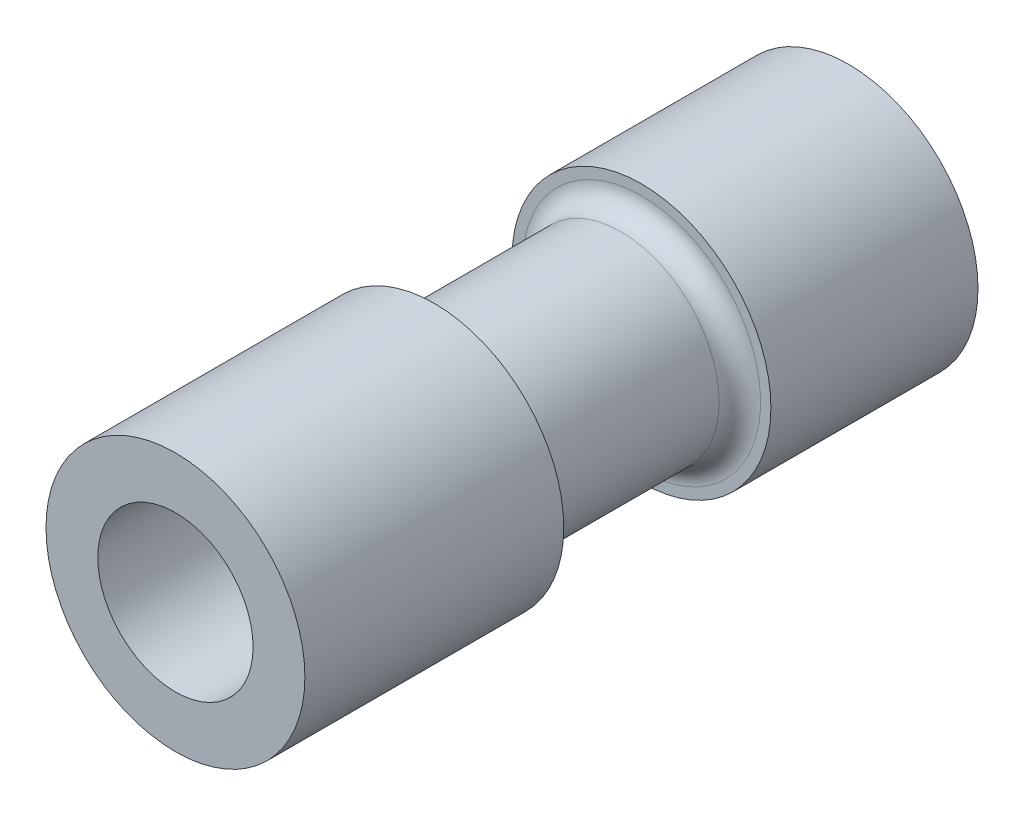
ISO-10303-21;
HEADER;
FILE_DESCRIPTION(('STEP AP214'),'2;1');
FILE_NAME('part.step','',(''),(''),'','','');
FILE_SCHEMA(('AUTOMOTIVE_DESIGN { 1 0 10303 214 1 1 1 1 }'));
ENDSEC;
DATA;
#1=APPLICATION_CONTEXT('core data for automotive mechanical design processes');
#2=APPLICATION_PROTOCOL_DEFINITION('international standard','automotive_design',2000,#1);
#3=PRODUCT_CONTEXT('',#1,'mechanical');
#4=PRODUCT('Part','Part','',(#3));
#5=PRODUCT_RELATED_PRODUCT_CATEGORY('part','',(#4));
#6=PRODUCT_DEFINITION_FORMATION('','',#4);
#7=PRODUCT_DEFINITION_CONTEXT('part definition',#1,'design');
#8=PRODUCT_DEFINITION('design','',#6,#7);
#9=PRODUCT_DEFINITION_SHAPE('','',#8);
#10=(LENGTH_UNIT() NAMED_UNIT(*) SI_UNIT(.MILLI.,.METRE.));
#11=(NAMED_UNIT(*) PLANE_ANGLE_UNIT() SI_UNIT($,.RADIAN.));
#12=(NAMED_UNIT(*) SI_UNIT($,.STERADIAN.) SOLID_ANGLE_UNIT());
#13=UNCERTAINTY_MEASURE_WITH_UNIT(LENGTH_MEASURE(1.E-05),#10,'distance_accuracy_value','');
#14=(GEOMETRIC_REPRESENTATION_CONTEXT(3) GLOBAL_UNCERTAINTY_ASSIGNED_CONTEXT((#13)) GLOBAL_UNIT_ASSIGNED_CONTEXT((#10,
#11,#12)) REPRESENTATION_CONTEXT('',''));
#15=CARTESIAN_POINT('',(0.,0.,0.));
#16=DIRECTION('',(0.,0.,1.));
#17=DIRECTION('',(1.,0.,0.));
#18=AXIS2_PLACEMENT_3D('',#15,#16,#17);
#19=CARTESIAN_POINT('',(0.,0.,13.));
#20=DIRECTION('',(0.,0.,1.));
#21=DIRECTION('',(1.,0.,0.));
#22=AXIS2_PLACEMENT_3D('',#19,#20,#21);
#23=CYLINDRICAL_SURFACE('',#22,0.999999999999997);
#24=CARTESIAN_POINT('',(0.,0.,0.));
#25=DIRECTION('',(0.,0.,1.));
#26=DIRECTION('',(1.,0.,0.));
#27=AXIS2_PLACEMENT_3D('',#24,#25,#26);
#28=CIRCLE('',#27,0.999999999999996);
#29=CARTESIAN_POINT('',(0.999999999999996,0.,0.));
#30=VERTEX_POINT('',#29);
#31=EDGE_CURVE('E123',#30,#30,#28,.T.);
#32=ORIENTED_EDGE('',*,*,#31,.F.);
#33=EDGE_LOOP('',(#32));
#34=FACE_BOUND('',#33,.T.);
#35=CARTESIAN_POINT('',(0.,0.,5.));
#36=DIRECTION('',(0.,0.,1.));
#37=DIRECTION('',(1.,0.,0.));
#38=AXIS2_PLACEMENT_3D('',#35,#36,#37);
#39=CIRCLE('',#38,0.999999999999997);
#40=CARTESIAN_POINT('',(0.999999999999997,0.,5.));
#41=VERTEX_POINT('',#40);
#42=EDGE_CURVE('E36',#41,#41,#39,.F.);
#43=ORIENTED_EDGE('',*,*,#42,.F.);
#44=EDGE_LOOP('',(#43));
#45=FACE_BOUND('',#44,.T.);
#46=ADVANCED_FACE('F32',(#34,#45),#23,.F.);
#47=CARTESIAN_POINT('',(0.,0.,13.));
#48=DIRECTION('',(0.,0.,-1.));
#49=DIRECTION('',(-1.,0.,0.));
#50=AXIS2_PLACEMENT_3D('',#47,#48,#49);
#51=CYLINDRICAL_SURFACE('',#50,2.5);
#52=CARTESIAN_POINT('',(0.,0.,0.));
#53=DIRECTION('',(0.,0.,1.));
#54=DIRECTION('',(1.,0.,0.));
#55=AXIS2_PLACEMENT_3D('',#52,#53,#54);
#56=CIRCLE('',#55,2.5);
#57=CARTESIAN_POINT('',(-2.5,0.,0.));
#58=VERTEX_POINT('',#57);
#59=EDGE_CURVE('E40',#58,#58,#56,.T.);
#60=CARTESIAN_POINT('',(0.,0.,4.));
#61=DIRECTION('',(0.,0.,1.));
#62=DIRECTION('',(1.,0.,0.));
#63=AXIS2_PLACEMENT_3D('',#60,#61,#62);
#64=CIRCLE('',#63,2.5);
#65=CARTESIAN_POINT('',(-2.5,0.,4.));
#66=VERTEX_POINT('',#65);
#67=EDGE_CURVE('E45',#66,#66,#64,.T.);
#68=CARTESIAN_POINT('',(-2.5,0.,0.));
#69=CARTESIAN_POINT('',(-2.5,0.,0.0416666666666667));
#70=CARTESIAN_POINT('',(-2.5,0.,0.0833333333333334));
#71=CARTESIAN_POINT('',(-2.5,0.,0.166666666666667));
#72=CARTESIAN_POINT('',(-2.5,0.,0.208333333333334));
#73=CARTESIAN_POINT('',(-2.5,0.,0.291666666666667));
#74=CARTESIAN_POINT('',(-2.5,0.,0.333333333333334));
#75=CARTESIAN_POINT('',(-2.5,0.,0.416666666666667));
#76=CARTESIAN_POINT('',(-2.5,0.,0.458333333333334));
#77=CARTESIAN_POINT('',(-2.5,0.,0.541666666666667));
#78=CARTESIAN_POINT('',(-2.5,0.,0.583333333333334));
#79=CARTESIAN_POINT('',(-2.5,0.,0.666666666666667));
#80=CARTESIAN_POINT('',(-2.5,0.,0.708333333333334));
#81=CARTESIAN_POINT('',(-2.5,0.,0.791666666666667));
#82=CARTESIAN_POINT('',(-2.5,0.,0.833333333333334));
#83=CARTESIAN_POINT('',(-2.5,0.,0.916666666666668));
#84=CARTESIAN_POINT('',(-2.5,0.,0.958333333333334));
#85=CARTESIAN_POINT('',(-2.5,0.,1.04166666666667));
#86=CARTESIAN_POINT('',(-2.5,0.,1.08333333333333));
#87=CARTESIAN_POINT('',(-2.5,0.,1.16666666666667));
#88=CARTESIAN_POINT('',(-2.5,0.,1.20833333333333));
#89=CARTESIAN_POINT('',(-2.5,0.,1.29166666666667));
#90=CARTESIAN_POINT('',(-2.5,0.,1.33333333333333));
#91=CARTESIAN_POINT('',(-2.5,0.,1.41666666666667));
#92=CARTESIAN_POINT('',(-2.5,0.,1.45833333333333));
#93=CARTESIAN_POINT('',(-2.5,0.,1.54166666666667));
#94=CARTESIAN_POINT('',(-2.5,0.,1.58333333333333));
#95=CARTESIAN_POINT('',(-2.5,0.,1.66666666666667));
#96=CARTESIAN_POINT('',(-2.5,0.,1.70833333333333));
#97=CARTESIAN_POINT('',(-2.5,0.,1.79166666666667));
#98=CARTESIAN_POINT('',(-2.5,0.,1.83333333333333));
#99=CARTESIAN_POINT('',(-2.5,0.,1.91666666666667));
#100=CARTESIAN_POINT('',(-2.5,0.,1.95833333333333));
#101=CARTESIAN_POINT('',(-2.5,0.,2.04166666666667));
#102=CARTESIAN_POINT('',(-2.5,0.,2.08333333333333));
#103=CARTESIAN_POINT('',(-2.5,0.,2.16666666666667));
#104=CARTESIAN_POINT('',(-2.5,0.,2.20833333333333));
#105=CARTESIAN_POINT('',(-2.5,0.,2.29166666666667));
#106=CARTESIAN_POINT('',(-2.5,0.,2.33333333333333));
#107=CARTESIAN_POINT('',(-2.5,0.,2.41666666666667));
#108=CARTESIAN_POINT('',(-2.5,0.,2.45833333333333));
#109=CARTESIAN_POINT('',(-2.5,0.,2.54166666666667));
#110=CARTESIAN_POINT('',(-2.5,0.,2.58333333333333));
#111=CARTESIAN_POINT('',(-2.5,0.,2.66666666666667));
#112=CARTESIAN_POINT('',(-2.5,0.,2.70833333333333));
#113=CARTESIAN_POINT('',(-2.5,0.,2.79166666666667));
#114=CARTESIAN_POINT('',(-2.5,0.,2.83333333333333));
#115=CARTESIAN_POINT('',(-2.5,0.,2.91666666666667));
#116=CARTESIAN_POINT('',(-2.5,0.,2.95833333333333));
#117=CARTESIAN_POINT('',(-2.5,0.,3.04166666666667));
#118=CARTESIAN_POINT('',(-2.5,0.,3.08333333333333));
#119=CARTESIAN_POINT('',(-2.5,0.,3.16666666666667));
#120=CARTESIAN_POINT('',(-2.5,0.,3.20833333333333));
#121=CARTESIAN_POINT('',(-2.5,0.,3.29166666666667));
#122=CARTESIAN_POINT('',(-2.5,0.,3.33333333333333));
#123=CARTESIAN_POINT('',(-2.5,0.,3.41666666666667));
#124=CARTESIAN_POINT('',(-2.5,0.,3.45833333333333));
#125=CARTESIAN_POINT('',(-2.5,0.,3.54166666666667));
#126=CARTESIAN_POINT('',(-2.5,0.,3.58333333333333));
#127=CARTESIAN_POINT('',(-2.5,0.,3.66666666666667));
#128=CARTESIAN_POINT('',(-2.5,0.,3.70833333333333));
#129=CARTESIAN_POINT('',(-2.5,0.,3.79166666666667));
#130=CARTESIAN_POINT('',(-2.5,0.,3.83333333333333));
#131=CARTESIAN_POINT('',(-2.5,0.,3.91666666666667));
#132=CARTESIAN_POINT('',(-2.5,0.,3.95833333333333));
#133=CARTESIAN_POINT('',(-2.5,0.,4.));
#134=B_SPLINE_CURVE_WITH_KNOTS('',3,(#68,#69,#70,#71,#72,#73,#74,#75,#76,#77,#78,#79,#80,#81,
#82,#83,#84,#85,#86,#87,#88,#89,#90,#91,#92,#93,#94,#95,#96,#97,#98,#99,#100,#101,#102,#103,
#104,#105,#106,#107,#108,#109,#110,#111,#112,#113,#114,#115,#116,#117,#118,#119,#120,#121,#122,
#123,#124,#125,#126,#127,#128,#129,#130,#131,#132,#133),.UNSPECIFIED.,.F.,.F.,(4,2,2,2,2,2,2,2,
2,2,2,2,2,2,2,2,2,2,2,2,2,2,2,2,2,2,2,2,2,2,2,2,4),(0.,0.125,0.25,0.375,0.5,0.625000000000001,
0.750000000000001,0.875000000000001,1.,1.125,1.25,1.375,1.5,1.625,1.75,1.875,2.,2.125,2.25,
2.375,2.5,2.625,2.75,2.875,3.,3.125,3.25,3.375,3.5,3.625,3.75,3.875,4.),.UNSPECIFIED.);
#135=EDGE_CURVE('BSEAM34',#58,#66,#134,.T.);
#136=ORIENTED_EDGE('',*,*,#59,.T.);
#137=ORIENTED_EDGE('',*,*,#67,.F.);
#138=ORIENTED_EDGE('',*,*,#135,.T.);
#139=ORIENTED_EDGE('',*,*,#135,.F.);
#140=EDGE_LOOP('',(#136,#138,#137,#139));
#141=FACE_BOUND('',#140,.T.);
#142=ADVANCED_FACE('F34',(#141),#51,.T.);
#143=CARTESIAN_POINT('',(0.,0.,0.));
#144=DIRECTION('',(0.,0.,1.));
#145=DIRECTION('',(1.,0.,0.));
#146=AXIS2_PLACEMENT_3D('',#143,#144,#145);
#147=PLANE('',#146);
#148=ORIENTED_EDGE('',*,*,#31,.T.);
#149=EDGE_LOOP('',(#148));
#150=FACE_BOUND('',#149,.T.);
#151=ORIENTED_EDGE('',*,*,#59,.F.);
#152=EDGE_LOOP('',(#151));
#153=FACE_BOUND('',#152,.T.);
#154=ADVANCED_FACE('F59',(#150,#153),#147,.F.);
#155=CARTESIAN_POINT('',(3.13823026620804,0.,4.));
#156=DIRECTION('',(0.,0.,1.));
#157=DIRECTION('',(1.,0.,0.));
#158=AXIS2_PLACEMENT_3D('',#155,#156,#157);
#159=PLANE('',#158);
#160=CARTESIAN_POINT('',(0.,0.,4.));
#161=DIRECTION('',(0.,0.,-1.));
#162=DIRECTION('',(-1.,0.,0.));
#163=AXIS2_PLACEMENT_3D('',#160,#161,#162);
#164=CIRCLE('',#163,2.3);
#165=CARTESIAN_POINT('',(-2.3,0.,4.));
#166=VERTEX_POINT('',#165);
#167=EDGE_CURVE('E48',#166,#166,#164,.T.);
#168=ORIENTED_EDGE('',*,*,#167,.T.);
#169=EDGE_LOOP('',(#168));
#170=FACE_BOUND('',#169,.T.);
#171=ORIENTED_EDGE('',*,*,#67,.T.);
#172=EDGE_LOOP('',(#171));
#173=FACE_BOUND('',#172,.T.);
#174=ADVANCED_FACE('F56',(#170,#173),#159,.T.);
#175=CARTESIAN_POINT('',(3.13823026620804,0.,8.));
#176=DIRECTION('',(0.,0.,-1.));
#177=DIRECTION('',(-1.,0.,0.));
#178=AXIS2_PLACEMENT_3D('',#175,#176,#177);
#179=PLANE('',#178);
#180=CARTESIAN_POINT('',(0.,0.,8.));
#181=DIRECTION('',(0.,0.,-1.));
#182=DIRECTION('',(-1.,0.,0.));
#183=AXIS2_PLACEMENT_3D('',#180,#181,#182);
#184=CIRCLE('',#183,2.3);
#185=CARTESIAN_POINT('',(-2.3,0.,8.));
#186=VERTEX_POINT('',#185);
#187=EDGE_CURVE('E118',#186,#186,#184,.T.);
#188=ORIENTED_EDGE('',*,*,#187,.F.);
#189=EDGE_LOOP('',(#188));
#190=FACE_BOUND('',#189,.T.);
#191=CARTESIAN_POINT('',(0.,0.,8.));
#192=DIRECTION('',(0.,0.,-1.));
#193=DIRECTION('',(-1.,0.,0.));
#194=AXIS2_PLACEMENT_3D('',#191,#192,#193);
#195=CIRCLE('',#194,2.5);
#196=CARTESIAN_POINT('',(-2.5,0.,8.));
#197=VERTEX_POINT('',#196);
#198=EDGE_CURVE('E51',#197,#197,#195,.T.);
#199=ORIENTED_EDGE('',*,*,#198,.T.);
#200=EDGE_LOOP('',(#199));
#201=FACE_BOUND('',#200,.T.);
#202=ADVANCED_FACE('F86',(#190,#201),#179,.T.);
#203=CARTESIAN_POINT('',(0.,0.,4.4));
#204=DIRECTION('',(0.,0.,-1.));
#205=DIRECTION('',(-1.,0.,0.));
#206=AXIS2_PLACEMENT_3D('',#203,#204,#205);
#207=TOROIDAL_SURFACE('',#206,2.3,0.4);
#208=CARTESIAN_POINT('',(0.,0.,4.4));
#209=DIRECTION('',(0.,0.,-1.));
#210=DIRECTION('',(-1.,0.,0.));
#211=AXIS2_PLACEMENT_3D('',#208,#209,#210);
#212=CIRCLE('',#211,1.9);
#213=CARTESIAN_POINT('',(-1.9,0.,4.4));
#214=VERTEX_POINT('',#213);
#215=EDGE_CURVE('E116',#214,#214,#212,.T.);
#216=ORIENTED_EDGE('',*,*,#215,.T.);
#217=EDGE_LOOP('',(#216));
#218=FACE_BOUND('',#217,.T.);
#219=ORIENTED_EDGE('',*,*,#167,.F.);
#220=EDGE_LOOP('',(#219));
#221=FACE_BOUND('',#220,.T.);
#222=ADVANCED_FACE('F88',(#218,#221),#207,.F.);
#223=CARTESIAN_POINT('',(0.,0.,0.));
#224=DIRECTION('',(0.,0.,-1.));
#225=DIRECTION('',(-1.,0.,0.));
#226=AXIS2_PLACEMENT_3D('',#223,#224,#225);
#227=CYLINDRICAL_SURFACE('',#226,1.9);
#228=CARTESIAN_POINT('',(0.,0.,7.6));
#229=DIRECTION('',(0.,0.,-1.));
#230=DIRECTION('',(-1.,0.,0.));
#231=AXIS2_PLACEMENT_3D('',#228,#229,#230);
#232=CIRCLE('',#231,1.9);
#233=CARTESIAN_POINT('',(-1.9,0.,7.6));
#234=VERTEX_POINT('',#233);
#235=EDGE_CURVE('E113',#234,#234,#232,.T.);
#236=ORIENTED_EDGE('',*,*,#235,.T.);
#237=EDGE_LOOP('',(#236));
#238=FACE_BOUND('',#237,.T.);
#239=ORIENTED_EDGE('',*,*,#215,.F.);
#240=EDGE_LOOP('',(#239));
#241=FACE_BOUND('',#240,.T.);
#242=ADVANCED_FACE('F95',(#238,#241),#227,.T.);
#243=CARTESIAN_POINT('',(0.,0.,7.6));
#244=DIRECTION('',(0.,0.,-1.));
#245=DIRECTION('',(-1.,0.,0.));
#246=AXIS2_PLACEMENT_3D('',#243,#244,#245);
#247=TOROIDAL_SURFACE('',#246,2.3,0.4);
#248=ORIENTED_EDGE('',*,*,#187,.T.);
#249=EDGE_LOOP('',(#248));
#250=FACE_BOUND('',#249,.T.);
#251=ORIENTED_EDGE('',*,*,#235,.F.);
#252=EDGE_LOOP('',(#251));
#253=FACE_BOUND('',#252,.T.);
#254=ADVANCED_FACE('F80',(#250,#253),#247,.F.);
#255=CARTESIAN_POINT('',(0.,0.,13.));
#256=DIRECTION('',(0.,0.,1.));
#257=DIRECTION('',(1.,0.,0.));
#258=AXIS2_PLACEMENT_3D('',#255,#256,#257);
#259=PLANE('',#258);
#260=CARTESIAN_POINT('',(0.,0.,13.));
#261=DIRECTION('',(0.,0.,1.));
#262=DIRECTION('',(1.,0.,0.));
#263=AXIS2_PLACEMENT_3D('',#260,#261,#262);
#264=CIRCLE('',#263,1.5);
#265=CARTESIAN_POINT('',(1.5,0.,13.));
#266=VERTEX_POINT('',#265);
#267=EDGE_CURVE('E126',#266,#266,#264,.T.);
#268=ORIENTED_EDGE('',*,*,#267,.F.);
#269=EDGE_LOOP('',(#268));
#270=FACE_BOUND('',#269,.T.);
#271=CARTESIAN_POINT('',(0.,0.,13.));
#272=DIRECTION('',(0.,0.,1.));
#273=DIRECTION('',(1.,0.,0.));
#274=AXIS2_PLACEMENT_3D('',#271,#272,#273);
#275=CIRCLE('',#274,2.5);
#276=CARTESIAN_POINT('',(-2.5,0.,13.));
#277=VERTEX_POINT('',#276);
#278=EDGE_CURVE('E10',#277,#277,#275,.T.);
#279=ORIENTED_EDGE('',*,*,#278,.T.);
#280=EDGE_LOOP('',(#279));
#281=FACE_BOUND('',#280,.T.);
#282=ADVANCED_FACE('F71',(#270,#281),#259,.T.);
#283=CARTESIAN_POINT('',(-2.5,0.,13.));
#284=CARTESIAN_POINT('',(-2.5,0.,12.9479166666667));
#285=CARTESIAN_POINT('',(-2.5,0.,12.8958333333333));
#286=CARTESIAN_POINT('',(-2.5,0.,12.7916666666667));
#287=CARTESIAN_POINT('',(-2.5,0.,12.7395833333333));
#288=CARTESIAN_POINT('',(-2.5,0.,12.6354166666667));
#289=CARTESIAN_POINT('',(-2.5,0.,12.5833333333333));
#290=CARTESIAN_POINT('',(-2.5,0.,12.4791666666667));
#291=CARTESIAN_POINT('',(-2.5,0.,12.4270833333333));
#292=CARTESIAN_POINT('',(-2.5,0.,12.3229166666667));
#293=CARTESIAN_POINT('',(-2.5,0.,12.2708333333333));
#294=CARTESIAN_POINT('',(-2.5,0.,12.1666666666667));
#295=CARTESIAN_POINT('',(-2.5,0.,12.1145833333333));
#296=CARTESIAN_POINT('',(-2.5,0.,12.0104166666667));
#297=CARTESIAN_POINT('',(-2.5,0.,11.9583333333333));
#298=CARTESIAN_POINT('',(-2.5,0.,11.8541666666667));
#299=CARTESIAN_POINT('',(-2.5,0.,11.8020833333333));
#300=CARTESIAN_POINT('',(-2.5,0.,11.6979166666667));
#301=CARTESIAN_POINT('',(-2.5,0.,11.6458333333333));
#302=CARTESIAN_POINT('',(-2.5,0.,11.5416666666667));
#303=CARTESIAN_POINT('',(-2.5,0.,11.4895833333333));
#304=CARTESIAN_POINT('',(-2.5,0.,11.3854166666667));
#305=CARTESIAN_POINT('',(-2.5,0.,11.3333333333333));
#306=CARTESIAN_POINT('',(-2.5,0.,11.2291666666667));
#307=CARTESIAN_POINT('',(-2.5,0.,11.1770833333333));
#308=CARTESIAN_POINT('',(-2.5,0.,11.0729166666667));
#309=CARTESIAN_POINT('',(-2.5,0.,11.0208333333333));
#310=CARTESIAN_POINT('',(-2.5,0.,10.9166666666667));
#311=CARTESIAN_POINT('',(-2.5,0.,10.8645833333333));
#312=CARTESIAN_POINT('',(-2.5,0.,10.7604166666667));
#313=CARTESIAN_POINT('',(-2.5,0.,10.7083333333333));
#314=CARTESIAN_POINT('',(-2.5,0.,10.6041666666667));
#315=CARTESIAN_POINT('',(-2.5,0.,10.5520833333333));
#316=CARTESIAN_POINT('',(-2.5,0.,10.4479166666667));
#317=CARTESIAN_POINT('',(-2.5,0.,10.3958333333333));
#318=CARTESIAN_POINT('',(-2.5,0.,10.2916666666667));
#319=CARTESIAN_POINT('',(-2.5,0.,10.2395833333333));
#320=CARTESIAN_POINT('',(-2.5,0.,10.1354166666667));
#321=CARTESIAN_POINT('',(-2.5,0.,10.0833333333333));
#322=CARTESIAN_POINT('',(-2.5,0.,9.97916666666667));
#323=CARTESIAN_POINT('',(-2.5,0.,9.92708333333333));
#324=CARTESIAN_POINT('',(-2.5,0.,9.82291666666667));
#325=CARTESIAN_POINT('',(-2.5,0.,9.77083333333333));
#326=CARTESIAN_POINT('',(-2.5,0.,9.66666666666667));
#327=CARTESIAN_POINT('',(-2.5,0.,9.61458333333333));
#328=CARTESIAN_POINT('',(-2.5,0.,9.51041666666667));
#329=CARTESIAN_POINT('',(-2.5,0.,9.45833333333333));
#330=CARTESIAN_POINT('',(-2.5,0.,9.35416666666667));
#331=CARTESIAN_POINT('',(-2.5,0.,9.30208333333333));
#332=CARTESIAN_POINT('',(-2.5,0.,9.19791666666667));
#333=CARTESIAN_POINT('',(-2.5,0.,9.14583333333333));
#334=CARTESIAN_POINT('',(-2.5,0.,9.04166666666667));
#335=CARTESIAN_POINT('',(-2.5,0.,8.98958333333333));
#336=CARTESIAN_POINT('',(-2.5,0.,8.88541666666667));
#337=CARTESIAN_POINT('',(-2.5,0.,8.83333333333333));
#338=CARTESIAN_POINT('',(-2.5,0.,8.72916666666667));
#339=CARTESIAN_POINT('',(-2.5,0.,8.67708333333333));
#340=CARTESIAN_POINT('',(-2.5,0.,8.57291666666667));
#341=CARTESIAN_POINT('',(-2.5,0.,8.52083333333333));
#342=CARTESIAN_POINT('',(-2.5,0.,8.41666666666667));
#343=CARTESIAN_POINT('',(-2.5,0.,8.36458333333333));
#344=CARTESIAN_POINT('',(-2.5,0.,8.26041666666667));
#345=CARTESIAN_POINT('',(-2.5,0.,8.20833333333333));
#346=CARTESIAN_POINT('',(-2.5,0.,8.10416666666667));
#347=CARTESIAN_POINT('',(-2.5,0.,8.05208333333333));
#348=CARTESIAN_POINT('',(-2.5,0.,8.));
#349=B_SPLINE_CURVE_WITH_KNOTS('',3,(#283,#284,#285,#286,#287,#288,#289,#290,#291,#292,#293,
#294,#295,#296,#297,#298,#299,#300,#301,#302,#303,#304,#305,#306,#307,#308,#309,#310,#311,#312,
#313,#314,#315,#316,#317,#318,#319,#320,#321,#322,#323,#324,#325,#326,#327,#328,#329,#330,#331,
#332,#333,#334,#335,#336,#337,#338,#339,#340,#341,#342,#343,#344,#345,#346,#347,#348),
.UNSPECIFIED.,.F.,.F.,(4,2,2,2,2,2,2,2,2,2,2,2,2,2,2,2,2,2,2,2,2,2,2,2,2,2,2,2,2,2,2,2,4),(0.,
0.156249999999998,0.312499999999999,0.468749999999999,0.624999999999999,0.781249999999999,
0.937499999999999,1.09375,1.25,1.40625,1.5625,1.71875,1.875,2.03125,2.1875,2.34375,2.5,2.65625,
2.8125,2.96875,3.125,3.28125,3.4375,3.59375,3.75,3.90625,4.0625,4.21875,4.375,4.53125,4.6875,
4.84375,5.),.UNSPECIFIED.);
#350=EDGE_CURVE('BSEAM61',#277,#197,#349,.T.);
#351=ORIENTED_EDGE('',*,*,#278,.F.);
#352=ORIENTED_EDGE('',*,*,#198,.F.);
#353=ORIENTED_EDGE('',*,*,#350,.T.);
#354=ORIENTED_EDGE('',*,*,#350,.F.);
#355=EDGE_LOOP('',(#351,#353,#352,#354));
#356=FACE_BOUND('',#355,.T.);
#357=ADVANCED_FACE('F61',(#356),#51,.T.);
#358=CARTESIAN_POINT('',(0.,0.,5.));
#359=DIRECTION('',(0.,0.,1.));
#360=DIRECTION('',(1.,0.,0.));
#361=AXIS2_PLACEMENT_3D('',#358,#359,#360);
#362=PLANE('',#361);
#363=CARTESIAN_POINT('',(0.,0.,5.));
#364=DIRECTION('',(0.,0.,1.));
#365=DIRECTION('',(1.,0.,0.));
#366=AXIS2_PLACEMENT_3D('',#363,#364,#365);
#367=CIRCLE('',#366,1.5);
#368=CARTESIAN_POINT('',(1.5,0.,5.));
#369=VERTEX_POINT('',#368);
#370=EDGE_CURVE('E129',#369,#369,#367,.T.);
#371=ORIENTED_EDGE('',*,*,#370,.T.);
#372=EDGE_LOOP('',(#371));
#373=FACE_BOUND('',#372,.T.);
#374=ORIENTED_EDGE('',*,*,#42,.T.);
#375=EDGE_LOOP('',(#374));
#376=FACE_BOUND('',#375,.T.);
#377=ADVANCED_FACE('F70',(#373,#376),#362,.T.);
#378=CARTESIAN_POINT('',(0.,0.,5.));
#379=DIRECTION('',(0.,0.,1.));
#380=DIRECTION('',(1.,0.,0.));
#381=AXIS2_PLACEMENT_3D('',#378,#379,#380);
#382=CYLINDRICAL_SURFACE('',#381,1.5);
#383=ORIENTED_EDGE('',*,*,#370,.F.);
#384=EDGE_LOOP('',(#383));
#385=FACE_BOUND('',#384,.T.);
#386=ORIENTED_EDGE('',*,*,#267,.T.);
#387=EDGE_LOOP('',(#386));
#388=FACE_BOUND('',#387,.T.);
#389=ADVANCED_FACE('F77',(#385,#388),#382,.F.);
#390=CLOSED_SHELL('',(#46,#142,#154,#174,#202,#222,#242,#254,#282,#357,#377,#389));
#391=MANIFOLD_SOLID_BREP('B2',#390);
#392=ADVANCED_BREP_SHAPE_REPRESENTATION('',(#18,#391),#14);
#393=SHAPE_DEFINITION_REPRESENTATION(#9,#392);
ENDSEC;
END-ISO-10303-21;
